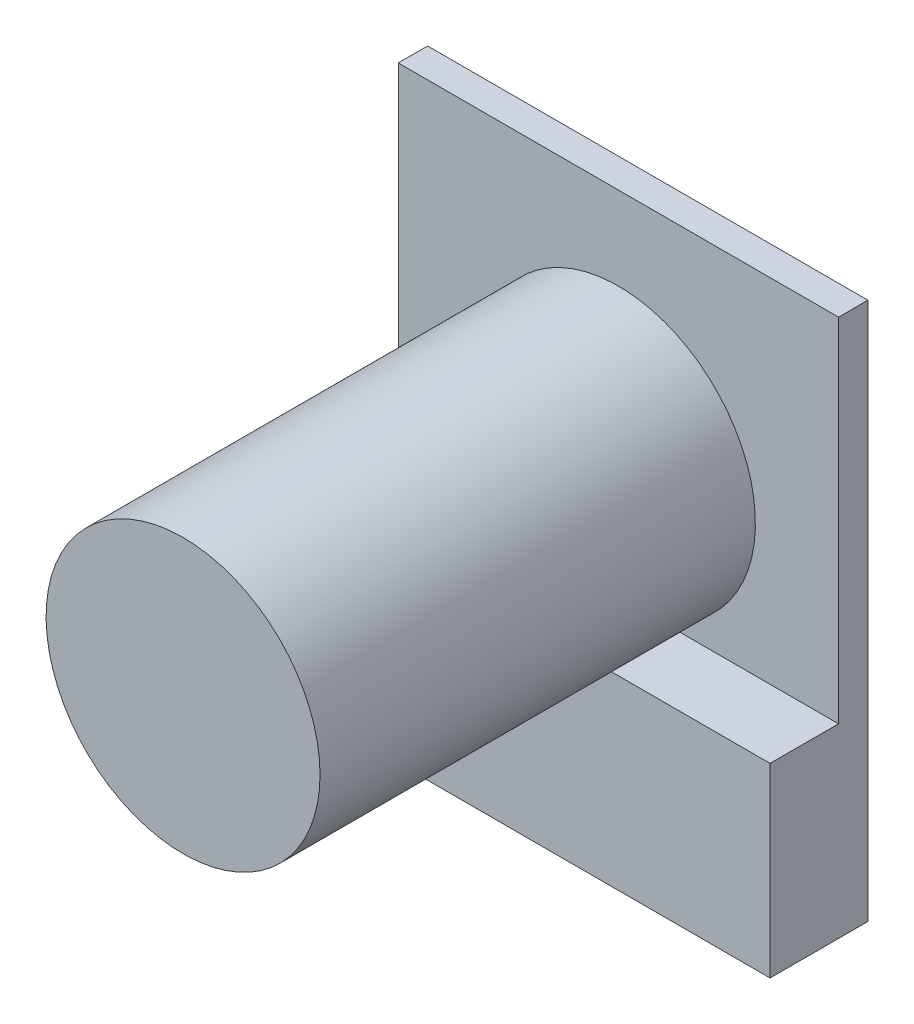
ISO-10303-21;
HEADER;
FILE_DESCRIPTION(('STEP AP214'),'2;1');
FILE_NAME('part.step','',(''),(''),'','','');
FILE_SCHEMA(('AUTOMOTIVE_DESIGN { 1 0 10303 214 1 1 1 1 }'));
ENDSEC;
DATA;
#1=APPLICATION_CONTEXT('core data for automotive mechanical design processes');
#2=APPLICATION_PROTOCOL_DEFINITION('international standard','automotive_design',2000,#1);
#3=PRODUCT_CONTEXT('',#1,'mechanical');
#4=PRODUCT('Part','Part','',(#3));
#5=PRODUCT_RELATED_PRODUCT_CATEGORY('part','',(#4));
#6=PRODUCT_DEFINITION_FORMATION('','',#4);
#7=PRODUCT_DEFINITION_CONTEXT('part definition',#1,'design');
#8=PRODUCT_DEFINITION('design','',#6,#7);
#9=PRODUCT_DEFINITION_SHAPE('','',#8);
#10=(LENGTH_UNIT() NAMED_UNIT(*) SI_UNIT(.MILLI.,.METRE.));
#11=(NAMED_UNIT(*) PLANE_ANGLE_UNIT() SI_UNIT($,.RADIAN.));
#12=(NAMED_UNIT(*) SI_UNIT($,.STERADIAN.) SOLID_ANGLE_UNIT());
#13=UNCERTAINTY_MEASURE_WITH_UNIT(LENGTH_MEASURE(1.E-05),#10,'distance_accuracy_value','');
#14=(GEOMETRIC_REPRESENTATION_CONTEXT(3) GLOBAL_UNCERTAINTY_ASSIGNED_CONTEXT((#13)) GLOBAL_UNIT_ASSIGNED_CONTEXT((#10,
#11,#12)) REPRESENTATION_CONTEXT('',''));
#15=CARTESIAN_POINT('',(0.,0.,0.));
#16=DIRECTION('',(0.,0.,1.));
#17=DIRECTION('',(1.,0.,0.));
#18=AXIS2_PLACEMENT_3D('',#15,#16,#17);
#19=CARTESIAN_POINT('',(0.,0.,6.));
#20=DIRECTION('',(0.,0.,1.));
#21=DIRECTION('',(1.,0.,0.));
#22=AXIS2_PLACEMENT_3D('',#19,#20,#21);
#23=PLANE('',#22);
#24=DIRECTION('',(0.,-1.,0.));
#25=VECTOR('',#24,1.);
#26=CARTESIAN_POINT('',(-45.,45.,6.));
#27=LINE('',#26,#25);
#28=CARTESIAN_POINT('',(-45.,45.,6.));
#29=VERTEX_POINT('',#28);
#30=CARTESIAN_POINT('',(-45.,-27.,6.));
#31=VERTEX_POINT('',#30);
#32=EDGE_CURVE('E88',#29,#31,#27,.T.);
#33=ORIENTED_EDGE('',*,*,#32,.T.);
#34=DIRECTION('',(1.,0.,0.));
#35=VECTOR('',#34,1.);
#36=CARTESIAN_POINT('',(0.,-27.,6.));
#37=LINE('',#36,#35);
#38=CARTESIAN_POINT('',(-7.41619848709566,-27.,6.00000000000001));
#39=VERTEX_POINT('',#38);
#40=EDGE_CURVE('E161',#31,#39,#37,.T.);
#41=ORIENTED_EDGE('',*,*,#40,.T.);
#42=CARTESIAN_POINT('',(0.,0.,6.00000000000001));
#43=DIRECTION('',(0.,0.,1.));
#44=DIRECTION('',(1.,0.,0.));
#45=AXIS2_PLACEMENT_3D('',#42,#43,#44);
#46=CIRCLE('',#45,28.);
#47=CARTESIAN_POINT('',(7.41619848709565,-27.,6.00000000000001));
#48=VERTEX_POINT('',#47);
#49=EDGE_CURVE('E103',#39,#48,#46,.F.);
#50=ORIENTED_EDGE('',*,*,#49,.T.);
#51=CARTESIAN_POINT('',(45.,-27.,6.));
#52=VERTEX_POINT('',#51);
#53=EDGE_CURVE('E123',#48,#52,#37,.T.);
#54=ORIENTED_EDGE('',*,*,#53,.T.);
#55=DIRECTION('',(0.,1.,0.));
#56=VECTOR('',#55,1.);
#57=CARTESIAN_POINT('',(45.,-45.,6.));
#58=LINE('',#57,#56);
#59=CARTESIAN_POINT('',(45.,45.,6.));
#60=VERTEX_POINT('',#59);
#61=EDGE_CURVE('E164',#52,#60,#58,.T.);
#62=ORIENTED_EDGE('',*,*,#61,.T.);
#63=DIRECTION('',(-1.,0.,0.));
#64=VECTOR('',#63,1.);
#65=CARTESIAN_POINT('',(45.,45.,6.));
#66=LINE('',#65,#64);
#67=EDGE_CURVE('E65',#60,#29,#66,.T.);
#68=ORIENTED_EDGE('',*,*,#67,.T.);
#69=EDGE_LOOP('',(#33,#41,#50,#54,#62,#68));
#70=FACE_BOUND('',#69,.T.);
#71=ADVANCED_FACE('F41',(#70),#23,.T.);
#72=CARTESIAN_POINT('',(0.,0.,95.));
#73=DIRECTION('',(0.,0.,-1.));
#74=DIRECTION('',(-1.,0.,0.));
#75=AXIS2_PLACEMENT_3D('',#72,#73,#74);
#76=CYLINDRICAL_SURFACE('',#75,28.);
#77=CARTESIAN_POINT('',(0.,0.,95.));
#78=DIRECTION('',(0.,0.,1.));
#79=DIRECTION('',(1.,0.,0.));
#80=AXIS2_PLACEMENT_3D('',#77,#78,#79);
#81=CIRCLE('',#80,28.);
#82=CARTESIAN_POINT('',(28.,0.,95.));
#83=VERTEX_POINT('',#82);
#84=EDGE_CURVE('E107',#83,#83,#81,.T.);
#85=ORIENTED_EDGE('',*,*,#84,.F.);
#86=EDGE_LOOP('',(#85));
#87=FACE_BOUND('',#86,.T.);
#88=DIRECTION('',(0.,0.,-1.));
#89=VECTOR('',#88,1.);
#90=CARTESIAN_POINT('',(-7.41619848709566,-27.,95.));
#91=LINE('',#90,#89);
#92=CARTESIAN_POINT('',(-7.41619848709568,-27.,20.));
#93=VERTEX_POINT('',#92);
#94=EDGE_CURVE('E11',#93,#39,#91,.T.);
#95=ORIENTED_EDGE('',*,*,#94,.F.);
#96=CARTESIAN_POINT('',(0.,0.,20.));
#97=DIRECTION('',(0.,0.,1.));
#98=DIRECTION('',(1.,0.,0.));
#99=AXIS2_PLACEMENT_3D('',#96,#97,#98);
#100=CIRCLE('',#99,28.);
#101=CARTESIAN_POINT('',(7.41619848709567,-27.,20.));
#102=VERTEX_POINT('',#101);
#103=EDGE_CURVE('E113',#93,#102,#100,.T.);
#104=ORIENTED_EDGE('',*,*,#103,.T.);
#105=DIRECTION('',(0.,0.,-1.));
#106=VECTOR('',#105,1.);
#107=CARTESIAN_POINT('',(7.41619848709565,-27.,95.));
#108=LINE('',#107,#106);
#109=EDGE_CURVE('E49',#48,#102,#108,.F.);
#110=ORIENTED_EDGE('',*,*,#109,.F.);
#111=ORIENTED_EDGE('',*,*,#49,.F.);
#112=EDGE_LOOP('',(#95,#104,#110,#111));
#113=FACE_BOUND('',#112,.T.);
#114=ADVANCED_FACE('F127',(#87,#113),#76,.T.);
#115=CARTESIAN_POINT('',(-45.,45.,6.));
#116=DIRECTION('',(1.,0.,0.));
#117=DIRECTION('',(0.,0.,-1.));
#118=AXIS2_PLACEMENT_3D('',#115,#116,#117);
#119=PLANE('',#118);
#120=DIRECTION('',(0.,-1.,0.));
#121=VECTOR('',#120,1.);
#122=CARTESIAN_POINT('',(-45.,45.,0.));
#123=LINE('',#122,#121);
#124=CARTESIAN_POINT('',(-45.,45.,0.));
#125=VERTEX_POINT('',#124);
#126=CARTESIAN_POINT('',(-45.,-65.,0.));
#127=VERTEX_POINT('',#126);
#128=EDGE_CURVE('E95',#125,#127,#123,.T.);
#129=ORIENTED_EDGE('',*,*,#128,.T.);
#130=DIRECTION('',(0.,0.,-1.));
#131=VECTOR('',#130,1.);
#132=CARTESIAN_POINT('',(-45.,-65.,20.));
#133=LINE('',#132,#131);
#134=CARTESIAN_POINT('',(-45.,-65.,20.));
#135=VERTEX_POINT('',#134);
#136=EDGE_CURVE('E158',#135,#127,#133,.T.);
#137=ORIENTED_EDGE('',*,*,#136,.F.);
#138=DIRECTION('',(0.,-1.,0.));
#139=VECTOR('',#138,1.);
#140=CARTESIAN_POINT('',(-45.,-27.,20.));
#141=LINE('',#140,#139);
#142=CARTESIAN_POINT('',(-45.,-27.,20.));
#143=VERTEX_POINT('',#142);
#144=EDGE_CURVE('E151',#143,#135,#141,.T.);
#145=ORIENTED_EDGE('',*,*,#144,.F.);
#146=DIRECTION('',(0.,0.,-1.));
#147=VECTOR('',#146,1.);
#148=CARTESIAN_POINT('',(-45.,-27.,20.));
#149=LINE('',#148,#147);
#150=EDGE_CURVE('E142',#143,#31,#149,.T.);
#151=ORIENTED_EDGE('',*,*,#150,.T.);
#152=ORIENTED_EDGE('',*,*,#32,.F.);
#153=DIRECTION('',(0.,0.,-1.));
#154=VECTOR('',#153,1.);
#155=CARTESIAN_POINT('',(-45.,45.,6.));
#156=LINE('',#155,#154);
#157=EDGE_CURVE('E81',#29,#125,#156,.T.);
#158=ORIENTED_EDGE('',*,*,#157,.T.);
#159=EDGE_LOOP('',(#129,#137,#145,#151,#152,#158));
#160=FACE_BOUND('',#159,.T.);
#161=ADVANCED_FACE('F43',(#160),#119,.F.);
#162=CARTESIAN_POINT('',(45.,-45.,6.));
#163=DIRECTION('',(-1.,0.,0.));
#164=DIRECTION('',(0.,0.,1.));
#165=AXIS2_PLACEMENT_3D('',#162,#163,#164);
#166=PLANE('',#165);
#167=DIRECTION('',(0.,0.,-1.));
#168=VECTOR('',#167,1.);
#169=CARTESIAN_POINT('',(45.,-65.,20.));
#170=LINE('',#169,#168);
#171=CARTESIAN_POINT('',(45.,-65.,20.));
#172=VERTEX_POINT('',#171);
#173=CARTESIAN_POINT('',(45.,-65.,0.));
#174=VERTEX_POINT('',#173);
#175=EDGE_CURVE('E155',#172,#174,#170,.T.);
#176=ORIENTED_EDGE('',*,*,#175,.T.);
#177=DIRECTION('',(0.,1.,0.));
#178=VECTOR('',#177,1.);
#179=CARTESIAN_POINT('',(45.,-45.,0.));
#180=LINE('',#179,#178);
#181=CARTESIAN_POINT('',(45.,45.,0.));
#182=VERTEX_POINT('',#181);
#183=EDGE_CURVE('E89',#174,#182,#180,.T.);
#184=ORIENTED_EDGE('',*,*,#183,.T.);
#185=DIRECTION('',(0.,0.,-1.));
#186=VECTOR('',#185,1.);
#187=CARTESIAN_POINT('',(45.,45.,6.));
#188=LINE('',#187,#186);
#189=EDGE_CURVE('E84',#60,#182,#188,.T.);
#190=ORIENTED_EDGE('',*,*,#189,.F.);
#191=ORIENTED_EDGE('',*,*,#61,.F.);
#192=DIRECTION('',(0.,0.,-1.));
#193=VECTOR('',#192,1.);
#194=CARTESIAN_POINT('',(45.,-27.,20.));
#195=LINE('',#194,#193);
#196=CARTESIAN_POINT('',(45.,-27.,20.));
#197=VERTEX_POINT('',#196);
#198=EDGE_CURVE('E153',#197,#52,#195,.T.);
#199=ORIENTED_EDGE('',*,*,#198,.F.);
#200=DIRECTION('',(0.,1.,0.));
#201=VECTOR('',#200,1.);
#202=CARTESIAN_POINT('',(45.,-65.,20.));
#203=LINE('',#202,#201);
#204=EDGE_CURVE('E144',#172,#197,#203,.T.);
#205=ORIENTED_EDGE('',*,*,#204,.F.);
#206=EDGE_LOOP('',(#176,#184,#190,#191,#199,#205));
#207=FACE_BOUND('',#206,.T.);
#208=ADVANCED_FACE('F169',(#207),#166,.F.);
#209=CARTESIAN_POINT('',(45.,45.,6.));
#210=DIRECTION('',(0.,-1.,0.));
#211=DIRECTION('',(0.,0.,-1.));
#212=AXIS2_PLACEMENT_3D('',#209,#210,#211);
#213=PLANE('',#212);
#214=DIRECTION('',(-1.,0.,0.));
#215=VECTOR('',#214,1.);
#216=CARTESIAN_POINT('',(45.,45.,0.));
#217=LINE('',#216,#215);
#218=EDGE_CURVE('E78',#182,#125,#217,.T.);
#219=ORIENTED_EDGE('',*,*,#218,.T.);
#220=ORIENTED_EDGE('',*,*,#157,.F.);
#221=ORIENTED_EDGE('',*,*,#67,.F.);
#222=ORIENTED_EDGE('',*,*,#189,.T.);
#223=EDGE_LOOP('',(#219,#220,#221,#222));
#224=FACE_BOUND('',#223,.T.);
#225=ADVANCED_FACE('F80',(#224),#213,.F.);
#226=CARTESIAN_POINT('',(0.,0.,0.));
#227=DIRECTION('',(0.,0.,1.));
#228=DIRECTION('',(1.,0.,0.));
#229=AXIS2_PLACEMENT_3D('',#226,#227,#228);
#230=PLANE('',#229);
#231=DIRECTION('',(1.,0.,0.));
#232=VECTOR('',#231,1.);
#233=CARTESIAN_POINT('',(-45.,-65.,0.));
#234=LINE('',#233,#232);
#235=EDGE_CURVE('E101',#127,#174,#234,.T.);
#236=ORIENTED_EDGE('',*,*,#235,.F.);
#237=ORIENTED_EDGE('',*,*,#128,.F.);
#238=ORIENTED_EDGE('',*,*,#218,.F.);
#239=ORIENTED_EDGE('',*,*,#183,.F.);
#240=EDGE_LOOP('',(#236,#237,#238,#239));
#241=FACE_BOUND('',#240,.T.);
#242=ADVANCED_FACE('F99',(#241),#230,.F.);
#243=CARTESIAN_POINT('',(0.,0.,95.));
#244=DIRECTION('',(0.,0.,1.));
#245=DIRECTION('',(1.,0.,0.));
#246=AXIS2_PLACEMENT_3D('',#243,#244,#245);
#247=PLANE('',#246);
#248=ORIENTED_EDGE('',*,*,#84,.T.);
#249=EDGE_LOOP('',(#248));
#250=FACE_BOUND('',#249,.T.);
#251=ADVANCED_FACE('F196',(#250),#247,.T.);
#252=CARTESIAN_POINT('',(45.,-27.,20.));
#253=DIRECTION('',(0.,-1.,0.));
#254=DIRECTION('',(1.,0.,0.));
#255=AXIS2_PLACEMENT_3D('',#252,#253,#254);
#256=PLANE('',#255);
#257=ORIENTED_EDGE('',*,*,#40,.F.);
#258=ORIENTED_EDGE('',*,*,#150,.F.);
#259=DIRECTION('',(-1.,0.,0.));
#260=VECTOR('',#259,1.);
#261=CARTESIAN_POINT('',(45.,-27.,20.));
#262=LINE('',#261,#260);
#263=EDGE_CURVE('E134',#93,#143,#262,.T.);
#264=ORIENTED_EDGE('',*,*,#263,.F.);
#265=ORIENTED_EDGE('',*,*,#94,.T.);
#266=EDGE_LOOP('',(#257,#258,#264,#265));
#267=FACE_BOUND('',#266,.T.);
#268=ADVANCED_FACE('F140',(#267),#256,.F.);
#269=CARTESIAN_POINT('',(-45.,-65.,20.));
#270=DIRECTION('',(0.,1.,0.));
#271=DIRECTION('',(0.,0.,1.));
#272=AXIS2_PLACEMENT_3D('',#269,#270,#271);
#273=PLANE('',#272);
#274=ORIENTED_EDGE('',*,*,#235,.T.);
#275=ORIENTED_EDGE('',*,*,#175,.F.);
#276=DIRECTION('',(1.,0.,0.));
#277=VECTOR('',#276,1.);
#278=CARTESIAN_POINT('',(-45.,-65.,20.));
#279=LINE('',#278,#277);
#280=EDGE_CURVE('E146',#135,#172,#279,.T.);
#281=ORIENTED_EDGE('',*,*,#280,.F.);
#282=ORIENTED_EDGE('',*,*,#136,.T.);
#283=EDGE_LOOP('',(#274,#275,#281,#282));
#284=FACE_BOUND('',#283,.T.);
#285=ADVANCED_FACE('F176',(#284),#273,.F.);
#286=ORIENTED_EDGE('',*,*,#53,.F.);
#287=ORIENTED_EDGE('',*,*,#109,.T.);
#288=EDGE_CURVE('E56',#197,#102,#262,.T.);
#289=ORIENTED_EDGE('',*,*,#288,.F.);
#290=ORIENTED_EDGE('',*,*,#198,.T.);
#291=EDGE_LOOP('',(#286,#287,#289,#290));
#292=FACE_BOUND('',#291,.T.);
#293=ADVANCED_FACE('F118',(#292),#256,.F.);
#294=CARTESIAN_POINT('',(0.,0.,20.));
#295=DIRECTION('',(0.,0.,1.));
#296=DIRECTION('',(1.,0.,0.));
#297=AXIS2_PLACEMENT_3D('',#294,#295,#296);
#298=PLANE('',#297);
#299=ORIENTED_EDGE('',*,*,#103,.F.);
#300=ORIENTED_EDGE('',*,*,#263,.T.);
#301=ORIENTED_EDGE('',*,*,#144,.T.);
#302=ORIENTED_EDGE('',*,*,#280,.T.);
#303=ORIENTED_EDGE('',*,*,#204,.T.);
#304=ORIENTED_EDGE('',*,*,#288,.T.);
#305=EDGE_LOOP('',(#299,#300,#301,#302,#303,#304));
#306=FACE_BOUND('',#305,.T.);
#307=ADVANCED_FACE('F131',(#306),#298,.T.);
#308=CLOSED_SHELL('',(#71,#114,#161,#208,#225,#242,#251,#268,#285,#293,#307));
#309=MANIFOLD_SOLID_BREP('B2',#308);
#310=ADVANCED_BREP_SHAPE_REPRESENTATION('',(#18,#309),#14);
#311=SHAPE_DEFINITION_REPRESENTATION(#9,#310);
ENDSEC;
END-ISO-10303-21;
